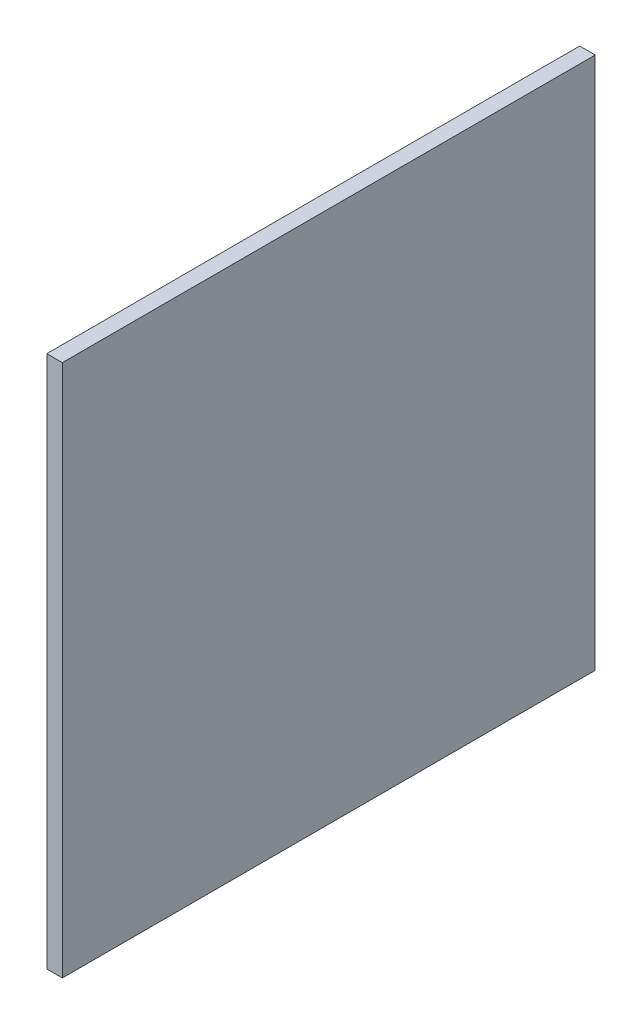
ISO-10303-21;
HEADER;
FILE_DESCRIPTION(('STEP AP214'),'2;1');
FILE_NAME('part.step','',(''),(''),'','','');
FILE_SCHEMA(('AUTOMOTIVE_DESIGN { 1 0 10303 214 1 1 1 1 }'));
ENDSEC;
DATA;
#1=APPLICATION_CONTEXT('core data for automotive mechanical design processes');
#2=APPLICATION_PROTOCOL_DEFINITION('international standard','automotive_design',2000,#1);
#3=PRODUCT_CONTEXT('',#1,'mechanical');
#4=PRODUCT('Part','Part','',(#3));
#5=PRODUCT_RELATED_PRODUCT_CATEGORY('part','',(#4));
#6=PRODUCT_DEFINITION_FORMATION('','',#4);
#7=PRODUCT_DEFINITION_CONTEXT('part definition',#1,'design');
#8=PRODUCT_DEFINITION('design','',#6,#7);
#9=PRODUCT_DEFINITION_SHAPE('','',#8);
#10=(LENGTH_UNIT() NAMED_UNIT(*) SI_UNIT(.MILLI.,.METRE.));
#11=(NAMED_UNIT(*) PLANE_ANGLE_UNIT() SI_UNIT($,.RADIAN.));
#12=(NAMED_UNIT(*) SI_UNIT($,.STERADIAN.) SOLID_ANGLE_UNIT());
#13=UNCERTAINTY_MEASURE_WITH_UNIT(LENGTH_MEASURE(1.E-05),#10,'distance_accuracy_value','');
#14=(GEOMETRIC_REPRESENTATION_CONTEXT(3) GLOBAL_UNCERTAINTY_ASSIGNED_CONTEXT((#13)) GLOBAL_UNIT_ASSIGNED_CONTEXT((#10,
#11,#12)) REPRESENTATION_CONTEXT('',''));
#15=CARTESIAN_POINT('',(0.,0.,0.));
#16=DIRECTION('',(0.,0.,1.));
#17=DIRECTION('',(1.,0.,0.));
#18=AXIS2_PLACEMENT_3D('',#15,#16,#17);
#19=CARTESIAN_POINT('',(-2.,68.6,0.));
#20=DIRECTION('',(0.,-1.,0.));
#21=DIRECTION('',(0.,0.,-1.));
#22=AXIS2_PLACEMENT_3D('',#19,#20,#21);
#23=PLANE('',#22);
#24=DIRECTION('',(0.,0.,-1.));
#25=VECTOR('',#24,1.);
#26=CARTESIAN_POINT('',(0.,68.6,0.));
#27=LINE('',#26,#25);
#28=CARTESIAN_POINT('',(0.,68.6,0.));
#29=VERTEX_POINT('',#28);
#30=CARTESIAN_POINT('',(0.,68.6,-68.6));
#31=VERTEX_POINT('',#30);
#32=EDGE_CURVE('E100',#29,#31,#27,.T.);
#33=ORIENTED_EDGE('',*,*,#32,.T.);
#34=DIRECTION('',(1.,0.,0.));
#35=VECTOR('',#34,1.);
#36=CARTESIAN_POINT('',(-2.,68.6,-68.6));
#37=LINE('',#36,#35);
#38=CARTESIAN_POINT('',(-2.,68.6,-68.6));
#39=VERTEX_POINT('',#38);
#40=EDGE_CURVE('E11',#39,#31,#37,.T.);
#41=ORIENTED_EDGE('',*,*,#40,.F.);
#42=DIRECTION('',(0.,0.,-1.));
#43=VECTOR('',#42,1.);
#44=CARTESIAN_POINT('',(-2.,68.6,0.));
#45=LINE('',#44,#43);
#46=CARTESIAN_POINT('',(-2.,68.6,0.));
#47=VERTEX_POINT('',#46);
#48=EDGE_CURVE('E77',#47,#39,#45,.T.);
#49=ORIENTED_EDGE('',*,*,#48,.F.);
#50=DIRECTION('',(1.,0.,0.));
#51=VECTOR('',#50,1.);
#52=CARTESIAN_POINT('',(-2.,68.6,0.));
#53=LINE('',#52,#51);
#54=EDGE_CURVE('E96',#47,#29,#53,.T.);
#55=ORIENTED_EDGE('',*,*,#54,.T.);
#56=EDGE_LOOP('',(#33,#41,#49,#55));
#57=FACE_BOUND('',#56,.T.);
#58=ADVANCED_FACE('F38',(#57),#23,.F.);
#59=CARTESIAN_POINT('',(-2.,0.,-68.6));
#60=DIRECTION('',(0.,0.,-1.));
#61=DIRECTION('',(-1.,0.,0.));
#62=AXIS2_PLACEMENT_3D('',#59,#60,#61);
#63=PLANE('',#62);
#64=DIRECTION('',(0.,1.,0.));
#65=VECTOR('',#64,1.);
#66=CARTESIAN_POINT('',(0.,0.,-68.6));
#67=LINE('',#66,#65);
#68=CARTESIAN_POINT('',(0.,0.,-68.6));
#69=VERTEX_POINT('',#68);
#70=EDGE_CURVE('E86',#69,#31,#67,.T.);
#71=ORIENTED_EDGE('',*,*,#70,.F.);
#72=DIRECTION('',(1.,0.,0.));
#73=VECTOR('',#72,1.);
#74=CARTESIAN_POINT('',(-2.,0.,-68.6));
#75=LINE('',#74,#73);
#76=CARTESIAN_POINT('',(-2.,0.,-68.6));
#77=VERTEX_POINT('',#76);
#78=EDGE_CURVE('E46',#77,#69,#75,.T.);
#79=ORIENTED_EDGE('',*,*,#78,.F.);
#80=DIRECTION('',(0.,1.,0.));
#81=VECTOR('',#80,1.);
#82=CARTESIAN_POINT('',(-2.,0.,-68.6));
#83=LINE('',#82,#81);
#84=EDGE_CURVE('E84',#77,#39,#83,.T.);
#85=ORIENTED_EDGE('',*,*,#84,.T.);
#86=ORIENTED_EDGE('',*,*,#40,.T.);
#87=EDGE_LOOP('',(#71,#79,#85,#86));
#88=FACE_BOUND('',#87,.T.);
#89=ADVANCED_FACE('F83',(#88),#63,.T.);
#90=CARTESIAN_POINT('',(-2.,0.,0.));
#91=DIRECTION('',(0.,-1.,0.));
#92=DIRECTION('',(0.,0.,-1.));
#93=AXIS2_PLACEMENT_3D('',#90,#91,#92);
#94=PLANE('',#93);
#95=DIRECTION('',(0.,0.,-1.));
#96=VECTOR('',#95,1.);
#97=CARTESIAN_POINT('',(0.,0.,0.));
#98=LINE('',#97,#96);
#99=CARTESIAN_POINT('',(0.,0.,0.));
#100=VERTEX_POINT('',#99);
#101=EDGE_CURVE('E104',#100,#69,#98,.T.);
#102=ORIENTED_EDGE('',*,*,#101,.F.);
#103=DIRECTION('',(1.,0.,0.));
#104=VECTOR('',#103,1.);
#105=CARTESIAN_POINT('',(-2.,0.,0.));
#106=LINE('',#105,#104);
#107=CARTESIAN_POINT('',(-2.,0.,0.));
#108=VERTEX_POINT('',#107);
#109=EDGE_CURVE('E69',#108,#100,#106,.T.);
#110=ORIENTED_EDGE('',*,*,#109,.F.);
#111=DIRECTION('',(0.,0.,-1.));
#112=VECTOR('',#111,1.);
#113=CARTESIAN_POINT('',(-2.,0.,0.));
#114=LINE('',#113,#112);
#115=EDGE_CURVE('E92',#108,#77,#114,.T.);
#116=ORIENTED_EDGE('',*,*,#115,.T.);
#117=ORIENTED_EDGE('',*,*,#78,.T.);
#118=EDGE_LOOP('',(#102,#110,#116,#117));
#119=FACE_BOUND('',#118,.T.);
#120=ADVANCED_FACE('F94',(#119),#94,.T.);
#121=CARTESIAN_POINT('',(-2.,0.,0.));
#122=DIRECTION('',(0.,0.,-1.));
#123=DIRECTION('',(-1.,0.,0.));
#124=AXIS2_PLACEMENT_3D('',#121,#122,#123);
#125=PLANE('',#124);
#126=DIRECTION('',(0.,1.,0.));
#127=VECTOR('',#126,1.);
#128=CARTESIAN_POINT('',(0.,0.,0.));
#129=LINE('',#128,#127);
#130=EDGE_CURVE('E72',#100,#29,#129,.T.);
#131=ORIENTED_EDGE('',*,*,#130,.T.);
#132=ORIENTED_EDGE('',*,*,#54,.F.);
#133=DIRECTION('',(0.,1.,0.));
#134=VECTOR('',#133,1.);
#135=CARTESIAN_POINT('',(-2.,0.,0.));
#136=LINE('',#135,#134);
#137=EDGE_CURVE('E54',#108,#47,#136,.T.);
#138=ORIENTED_EDGE('',*,*,#137,.F.);
#139=ORIENTED_EDGE('',*,*,#109,.T.);
#140=EDGE_LOOP('',(#131,#132,#138,#139));
#141=FACE_BOUND('',#140,.T.);
#142=ADVANCED_FACE('F117',(#141),#125,.F.);
#143=CARTESIAN_POINT('',(-2.,0.,0.));
#144=DIRECTION('',(1.,0.,0.));
#145=DIRECTION('',(0.,0.,-1.));
#146=AXIS2_PLACEMENT_3D('',#143,#144,#145);
#147=PLANE('',#146);
#148=ORIENTED_EDGE('',*,*,#48,.T.);
#149=ORIENTED_EDGE('',*,*,#84,.F.);
#150=ORIENTED_EDGE('',*,*,#115,.F.);
#151=ORIENTED_EDGE('',*,*,#137,.T.);
#152=EDGE_LOOP('',(#148,#149,#150,#151));
#153=FACE_BOUND('',#152,.T.);
#154=ADVANCED_FACE('F91',(#153),#147,.F.);
#155=CARTESIAN_POINT('',(0.,0.,0.));
#156=DIRECTION('',(1.,0.,0.));
#157=DIRECTION('',(0.,0.,-1.));
#158=AXIS2_PLACEMENT_3D('',#155,#156,#157);
#159=PLANE('',#158);
#160=ORIENTED_EDGE('',*,*,#32,.F.);
#161=ORIENTED_EDGE('',*,*,#130,.F.);
#162=ORIENTED_EDGE('',*,*,#101,.T.);
#163=ORIENTED_EDGE('',*,*,#70,.T.);
#164=EDGE_LOOP('',(#160,#161,#162,#163));
#165=FACE_BOUND('',#164,.T.);
#166=ADVANCED_FACE('F111',(#165),#159,.T.);
#167=CLOSED_SHELL('',(#58,#89,#120,#142,#154,#166));
#168=MANIFOLD_SOLID_BREP('B2',#167);
#169=ADVANCED_BREP_SHAPE_REPRESENTATION('',(#18,#168),#14);
#170=SHAPE_DEFINITION_REPRESENTATION(#9,#169);
ENDSEC;
END-ISO-10303-21;
